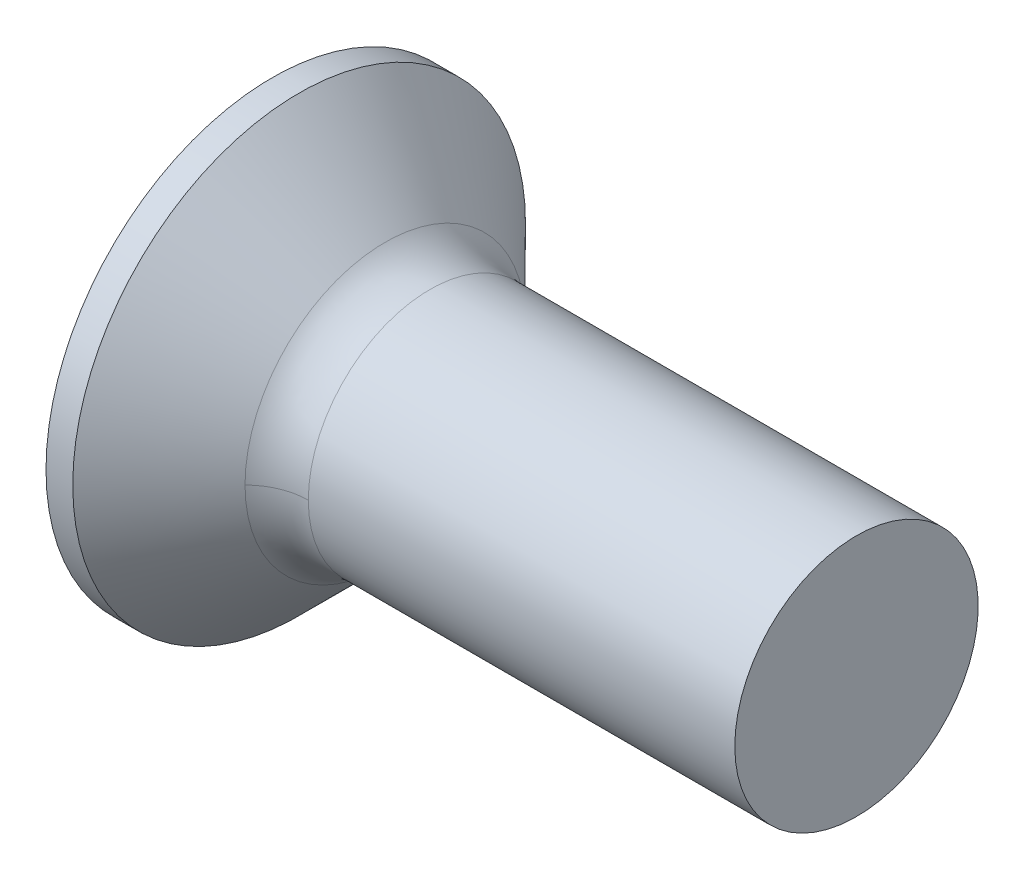
ISO-10303-21;
HEADER;
FILE_DESCRIPTION(('STEP AP214'),'2;1');
FILE_NAME('part.step','',(''),(''),'','','');
FILE_SCHEMA(('AUTOMOTIVE_DESIGN { 1 0 10303 214 1 1 1 1 }'));
ENDSEC;
DATA;
#1=APPLICATION_CONTEXT('core data for automotive mechanical design processes');
#2=APPLICATION_PROTOCOL_DEFINITION('international standard','automotive_design',2000,#1);
#3=PRODUCT_CONTEXT('',#1,'mechanical');
#4=PRODUCT('Part','Part','',(#3));
#5=PRODUCT_RELATED_PRODUCT_CATEGORY('part','',(#4));
#6=PRODUCT_DEFINITION_FORMATION('','',#4);
#7=PRODUCT_DEFINITION_CONTEXT('part definition',#1,'design');
#8=PRODUCT_DEFINITION('design','',#6,#7);
#9=PRODUCT_DEFINITION_SHAPE('','',#8);
#10=(LENGTH_UNIT() NAMED_UNIT(*) SI_UNIT(.MILLI.,.METRE.));
#11=(NAMED_UNIT(*) PLANE_ANGLE_UNIT() SI_UNIT($,.RADIAN.));
#12=(NAMED_UNIT(*) SI_UNIT($,.STERADIAN.) SOLID_ANGLE_UNIT());
#13=UNCERTAINTY_MEASURE_WITH_UNIT(LENGTH_MEASURE(1.E-05),#10,'distance_accuracy_value','');
#14=(GEOMETRIC_REPRESENTATION_CONTEXT(3) GLOBAL_UNCERTAINTY_ASSIGNED_CONTEXT((#13)) GLOBAL_UNIT_ASSIGNED_CONTEXT((#10,
#11,#12)) REPRESENTATION_CONTEXT('',''));
#15=CARTESIAN_POINT('',(0.,0.,0.));
#16=DIRECTION('',(0.,0.,1.));
#17=DIRECTION('',(1.,0.,0.));
#18=AXIS2_PLACEMENT_3D('',#15,#16,#17);
#19=CARTESIAN_POINT('',(3.05,0.,0.));
#20=DIRECTION('',(-1.,0.,0.));
#21=DIRECTION('',(0.,0.,1.));
#22=AXIS2_PLACEMENT_3D('',#19,#20,#21);
#23=CONICAL_SURFACE('',#22,0.851,0.0698131699402238);
#24=CARTESIAN_POINT('',(3.05,0.,0.));
#25=DIRECTION('',(-1.,0.,0.));
#26=DIRECTION('',(0.,0.,1.));
#27=AXIS2_PLACEMENT_3D('',#24,#25,#26);
#28=CIRCLE('',#27,0.851);
#29=CARTESIAN_POINT('',(3.05,0.515000000128447,-0.677477674811281));
#30=VERTEX_POINT('',#29);
#31=CARTESIAN_POINT('',(3.04999999998945,0.677477674911265,-0.514999999998138));
#32=VERTEX_POINT('',#31);
#33=EDGE_CURVE('E126',#30,#32,#28,.F.);
#34=ORIENTED_EDGE('',*,*,#33,.T.);
#35=CARTESIAN_POINT('',(-7.67570391463201E-11,0.931375357170448,-0.515));
#36=CARTESIAN_POINT('',(0.330572472848562,0.904946417906444,-0.515));
#37=CARTESIAN_POINT('',(0.661126771646041,0.878283148604802,-0.515));
#38=CARTESIAN_POINT('',(1.32217705983663,0.824265652939466,-0.515));
#39=CARTESIAN_POINT('',(1.65267304953057,0.796911430252112,-0.515));
#40=CARTESIAN_POINT('',(2.16096789406414,0.754133835706705,-0.515));
#41=CARTESIAN_POINT('',(2.33879401122227,0.739034945221815,-0.515));
#42=CARTESIAN_POINT('',(2.69441897396936,0.708513656055335,-0.515));
#43=CARTESIAN_POINT('',(2.87221781947904,0.693091256450383,-0.515));
#44=CARTESIAN_POINT('',(3.049999999979,0.677477674910982,-0.515));
#45=B_SPLINE_CURVE_WITH_KNOTS('',3,(#35,#36,#37,#38,#39,#40,#41,#42,#43,#44),.UNSPECIFIED.,.F.,
.F.,(4,2,2,2,4),(0.,0.994882626466528,1.98975996059805,2.52515761420332,3.06055679615058),.UNSPECIFIED.);
#46=CARTESIAN_POINT('',(0.,0.931375357164314,-0.515));
#47=VERTEX_POINT('',#46);
#48=EDGE_CURVE('E119',#47,#32,#45,.T.);
#49=ORIENTED_EDGE('',*,*,#48,.F.);
#50=CARTESIAN_POINT('',(0.,0.,0.));
#51=DIRECTION('',(-1.,0.,0.));
#52=DIRECTION('',(0.,0.,1.));
#53=AXIS2_PLACEMENT_3D('',#50,#51,#52);
#54=CIRCLE('',#53,1.064276776);
#55=CARTESIAN_POINT('',(-3.68055372291726E-11,0.515,-0.931375357167255));
#56=VERTEX_POINT('',#55);
#57=EDGE_CURVE('E20',#47,#56,#54,.T.);
#58=ORIENTED_EDGE('',*,*,#57,.T.);
#59=CARTESIAN_POINT('',(3.04999999998465,0.515,-0.677477674910271));
#60=CARTESIAN_POINT('',(2.78584457189711,0.515,-0.700667836997838));
#61=CARTESIAN_POINT('',(2.52165382800828,0.515,-0.723450546558568));
#62=CARTESIAN_POINT('',(1.9932175722748,0.515,-0.768360334127793));
#63=CARTESIAN_POINT('',(1.72897206064354,0.515,-0.79048741464414));
#64=CARTESIAN_POINT('',(1.2206193561181,0.515,-0.832574721749591));
#65=CARTESIAN_POINT('',(0.976515168975279,0.515,-0.852571390109687));
#66=CARTESIAN_POINT('',(0.488277611396775,0.515,-0.892216155988628));
#67=CARTESIAN_POINT('',(0.244144240861769,0.515,-0.911864252285126));
#68=CARTESIAN_POINT('',(-7.3606800830503E-11,0.515,-0.931375357170245));
#69=B_SPLINE_CURVE_WITH_KNOTS('',3,(#59,#60,#61,#62,#63,#64,#65,#66,#67,#68),.UNSPECIFIED.,.F.,
.F.,(4,2,2,2,4),(0.,0.795513252853999,1.59102346239218,2.3257888297006,3.06055677312136),.UNSPECIFIED.);
#70=EDGE_CURVE('E149',#30,#56,#69,.T.);
#71=ORIENTED_EDGE('',*,*,#70,.F.);
#72=EDGE_LOOP('',(#34,#49,#58,#71));
#73=FACE_BOUND('',#72,.T.);
#74=ADVANCED_FACE('F16',(#73),#23,.F.);
#75=CARTESIAN_POINT('',(0.,0.666842541,-0.515));
#76=DIRECTION('',(0.,0.,1.));
#77=DIRECTION('',(1.,0.,0.));
#78=AXIS2_PLACEMENT_3D('',#75,#76,#77);
#79=PLANE('',#78);
#80=DIRECTION('',(0.,1.,0.));
#81=VECTOR('',#80,1.);
#82=CARTESIAN_POINT('',(3.05,1.5637388375,-0.515));
#83=LINE('',#82,#81);
#84=CARTESIAN_POINT('',(3.05,0.929326148090736,-0.515));
#85=VERTEX_POINT('',#84);
#86=EDGE_CURVE('E140',#32,#85,#83,.T.);
#87=ORIENTED_EDGE('',*,*,#86,.T.);
#88=DIRECTION('',(0.894934367760736,-0.446197800757345,0.));
#89=VECTOR('',#88,1.);
#90=CARTESIAN_POINT('',(1.525,1.689663074,-0.515));
#91=LINE('',#90,#89);
#92=CARTESIAN_POINT('',(0.,2.44999999986994,-0.515));
#93=VERTEX_POINT('',#92);
#94=EDGE_CURVE('E123',#93,#85,#91,.T.);
#95=ORIENTED_EDGE('',*,*,#94,.F.);
#96=DIRECTION('',(0.,-1.,0.));
#97=VECTOR('',#96,1.);
#98=CARTESIAN_POINT('',(0.,1.5637388375,-0.515));
#99=LINE('',#98,#97);
#100=EDGE_CURVE('E114',#93,#47,#99,.T.);
#101=ORIENTED_EDGE('',*,*,#100,.T.);
#102=ORIENTED_EDGE('',*,*,#48,.T.);
#103=EDGE_LOOP('',(#87,#95,#101,#102));
#104=FACE_BOUND('',#103,.T.);
#105=ADVANCED_FACE('F117',(#104),#79,.T.);
#106=CARTESIAN_POINT('',(12.,-2.53,2.53));
#107=DIRECTION('',(1.,0.,0.));
#108=DIRECTION('',(0.,0.,-1.));
#109=AXIS2_PLACEMENT_3D('',#106,#107,#108);
#110=PLANE('',#109);
#111=CARTESIAN_POINT('',(12.,0.,0.));
#112=DIRECTION('',(-1.,0.,0.));
#113=DIRECTION('',(0.,0.,1.));
#114=AXIS2_PLACEMENT_3D('',#111,#112,#113);
#115=CIRCLE('',#114,2.5);
#116=CARTESIAN_POINT('',(12.,0.,2.5));
#117=VERTEX_POINT('',#116);
#118=EDGE_CURVE('E381',#117,#117,#115,.F.);
#119=ORIENTED_EDGE('',*,*,#118,.T.);
#120=EDGE_LOOP('',(#119));
#121=FACE_BOUND('',#120,.T.);
#122=ADVANCED_FACE('F520',(#121),#110,.T.);
#123=CARTESIAN_POINT('',(0.,0.515,-2.460635134));
#124=DIRECTION('',(0.,-1.,0.));
#125=DIRECTION('',(1.,0.,0.));
#126=AXIS2_PLACEMENT_3D('',#123,#124,#125);
#127=PLANE('',#126);
#128=DIRECTION('',(0.,0.,-1.));
#129=VECTOR('',#128,1.);
#130=CARTESIAN_POINT('',(0.,0.515,-1.5637388375));
#131=LINE('',#130,#129);
#132=CARTESIAN_POINT('',(0.,0.515,-2.44999999986994));
#133=VERTEX_POINT('',#132);
#134=EDGE_CURVE('E135',#56,#133,#131,.T.);
#135=ORIENTED_EDGE('',*,*,#134,.T.);
#136=DIRECTION('',(-0.894934367760736,0.,-0.446197800757345));
#137=VECTOR('',#136,1.);
#138=CARTESIAN_POINT('',(1.525,0.515,-1.689663074));
#139=LINE('',#138,#137);
#140=CARTESIAN_POINT('',(3.05,0.515,-0.929326148090736));
#141=VERTEX_POINT('',#140);
#142=EDGE_CURVE('E363',#141,#133,#139,.T.);
#143=ORIENTED_EDGE('',*,*,#142,.F.);
#144=DIRECTION('',(0.,0.,1.));
#145=VECTOR('',#144,1.);
#146=CARTESIAN_POINT('',(3.05,0.515,-1.5637388375));
#147=LINE('',#146,#145);
#148=EDGE_CURVE('E141',#141,#30,#147,.T.);
#149=ORIENTED_EDGE('',*,*,#148,.T.);
#150=ORIENTED_EDGE('',*,*,#70,.T.);
#151=EDGE_LOOP('',(#135,#143,#149,#150));
#152=FACE_BOUND('',#151,.T.);
#153=ADVANCED_FACE('F553',(#152),#127,.T.);
#154=CARTESIAN_POINT('',(0.,2.45,-0.515));
#155=DIRECTION('',(-0.446197800757345,-0.894934367760736,0.));
#156=DIRECTION('',(0.894934367760736,-0.446197800757345,0.));
#157=AXIS2_PLACEMENT_3D('',#154,#155,#156);
#158=PLANE('',#157);
#159=ORIENTED_EDGE('',*,*,#94,.T.);
#160=DIRECTION('',(0.,0.,1.));
#161=VECTOR('',#160,1.);
#162=CARTESIAN_POINT('',(3.05,0.929326148,0.));
#163=LINE('',#162,#161);
#164=CARTESIAN_POINT('',(3.05,0.929326148136104,0.515));
#165=VERTEX_POINT('',#164);
#166=EDGE_CURVE('E379',#85,#165,#163,.T.);
#167=ORIENTED_EDGE('',*,*,#166,.T.);
#168=DIRECTION('',(0.894934367838347,-0.446197800601682,0.));
#169=VECTOR('',#168,1.);
#170=CARTESIAN_POINT('',(0.,2.44999999960982,0.515));
#171=LINE('',#170,#169);
#172=CARTESIAN_POINT('',(0.,2.44999999980491,0.515));
#173=VERTEX_POINT('',#172);
#174=EDGE_CURVE('E353',#173,#165,#171,.T.);
#175=ORIENTED_EDGE('',*,*,#174,.F.);
#176=DIRECTION('',(0.,0.,-1.));
#177=VECTOR('',#176,1.);
#178=CARTESIAN_POINT('',(0.,2.45,0.));
#179=LINE('',#178,#177);
#180=EDGE_CURVE('E374',#173,#93,#179,.T.);
#181=ORIENTED_EDGE('',*,*,#180,.T.);
#182=EDGE_LOOP('',(#159,#167,#175,#181));
#183=FACE_BOUND('',#182,.T.);
#184=ADVANCED_FACE('F165',(#183),#158,.T.);
#185=CARTESIAN_POINT('',(12.,0.,0.));
#186=DIRECTION('',(-1.,0.,0.));
#187=DIRECTION('',(0.,0.,1.));
#188=AXIS2_PLACEMENT_3D('',#185,#186,#187);
#189=CYLINDRICAL_SURFACE('',#188,2.5);
#190=ORIENTED_EDGE('',*,*,#118,.F.);
#191=EDGE_LOOP('',(#190));
#192=FACE_BOUND('',#191,.T.);
#193=CARTESIAN_POINT('',(3.23847763096331,0.,0.));
#194=DIRECTION('',(1.,0.,0.));
#195=DIRECTION('',(0.,1.,0.));
#196=AXIS2_PLACEMENT_3D('',#193,#194,#195);
#197=CIRCLE('',#196,2.49999999985679);
#198=CARTESIAN_POINT('',(3.23847763096991,-2.56379285644164E-10,-2.49999999989259));
#199=VERTEX_POINT('',#198);
#200=CARTESIAN_POINT('',(3.23847763095945,-1.12242035535916E-10,2.49999999989259));
#201=VERTEX_POINT('',#200);
#202=EDGE_CURVE('E343',#199,#201,#197,.T.);
#203=ORIENTED_EDGE('',*,*,#202,.T.);
#204=CARTESIAN_POINT('',(3.23847763096331,0.,0.));
#205=DIRECTION('',(1.,0.,0.));
#206=DIRECTION('',(0.,1.,0.));
#207=AXIS2_PLACEMENT_3D('',#204,#205,#206);
#208=CIRCLE('',#207,2.49999999985679);
#209=EDGE_CURVE('E332',#201,#199,#208,.T.);
#210=ORIENTED_EDGE('',*,*,#209,.T.);
#211=EDGE_LOOP('',(#203,#210));
#212=FACE_BOUND('',#211,.T.);
#213=ADVANCED_FACE('F160',(#192,#212),#189,.T.);
#214=CARTESIAN_POINT('',(3.05,0.515,-0.929326148));
#215=DIRECTION('',(-0.446197800757345,0.,0.894934367760736));
#216=DIRECTION('',(-0.894934367760736,0.,-0.446197800757345));
#217=AXIS2_PLACEMENT_3D('',#214,#215,#216);
#218=PLANE('',#217);
#219=DIRECTION('',(-0.894934367838347,0.,-0.446197800601682));
#220=VECTOR('',#219,1.);
#221=CARTESIAN_POINT('',(3.05,-0.515,-0.929326148272208));
#222=LINE('',#221,#220);
#223=CARTESIAN_POINT('',(3.05,-0.515,-0.929326148136104));
#224=VERTEX_POINT('',#223);
#225=CARTESIAN_POINT('',(0.,-0.515,-2.44999999980491));
#226=VERTEX_POINT('',#225);
#227=EDGE_CURVE('E318',#224,#226,#222,.T.);
#228=ORIENTED_EDGE('',*,*,#227,.F.);
#229=DIRECTION('',(0.,1.,0.));
#230=VECTOR('',#229,1.);
#231=CARTESIAN_POINT('',(3.05,0.,-0.929326148));
#232=LINE('',#231,#230);
#233=EDGE_CURVE('E356',#224,#141,#232,.T.);
#234=ORIENTED_EDGE('',*,*,#233,.T.);
#235=ORIENTED_EDGE('',*,*,#142,.T.);
#236=DIRECTION('',(0.,-1.,0.));
#237=VECTOR('',#236,1.);
#238=CARTESIAN_POINT('',(0.,0.,-2.45));
#239=LINE('',#238,#237);
#240=EDGE_CURVE('E359',#133,#226,#239,.T.);
#241=ORIENTED_EDGE('',*,*,#240,.T.);
#242=EDGE_LOOP('',(#228,#234,#235,#241));
#243=FACE_BOUND('',#242,.T.);
#244=ADVANCED_FACE('F164',(#243),#218,.T.);
#245=CARTESIAN_POINT('',(0.,0.666842541,0.515));
#246=DIRECTION('',(0.,0.,-1.));
#247=DIRECTION('',(0.,1.,0.));
#248=AXIS2_PLACEMENT_3D('',#245,#246,#247);
#249=PLANE('',#248);
#250=DIRECTION('',(0.,1.,0.));
#251=VECTOR('',#250,1.);
#252=CARTESIAN_POINT('',(0.,1.5637388375,0.515));
#253=LINE('',#252,#251);
#254=CARTESIAN_POINT('',(0.,0.931375357164314,0.515));
#255=VERTEX_POINT('',#254);
#256=EDGE_CURVE('E348',#255,#173,#253,.T.);
#257=ORIENTED_EDGE('',*,*,#256,.T.);
#258=ORIENTED_EDGE('',*,*,#174,.T.);
#259=DIRECTION('',(0.,-1.,0.));
#260=VECTOR('',#259,1.);
#261=CARTESIAN_POINT('',(3.05,1.5637388375,0.515));
#262=LINE('',#261,#260);
#263=CARTESIAN_POINT('',(3.05,0.677477675015967,0.514999999859184));
#264=VERTEX_POINT('',#263);
#265=EDGE_CURVE('E354',#165,#264,#262,.T.);
#266=ORIENTED_EDGE('',*,*,#265,.T.);
#267=CARTESIAN_POINT('',(-8.40686860052449E-11,0.931375357171032,0.515));
#268=CARTESIAN_POINT('',(0.330572472841409,0.90494641790702,0.515));
#269=CARTESIAN_POINT('',(0.661126771639048,0.878283148605369,0.515));
#270=CARTESIAN_POINT('',(1.32217705982996,0.824265652940016,0.515));
#271=CARTESIAN_POINT('',(1.65267304952405,0.796911430252655,0.515));
#272=CARTESIAN_POINT('',(2.16096789405845,0.754133835707187,0.515));
#273=CARTESIAN_POINT('',(2.33879401121725,0.739034945222243,0.515));
#274=CARTESIAN_POINT('',(2.69441897396568,0.708513656055654,0.515));
#275=CARTESIAN_POINT('',(2.87221781947602,0.693091256450646,0.515));
#276=CARTESIAN_POINT('',(3.04999999997665,0.677477674911189,0.515));
#277=B_SPLINE_CURVE_WITH_KNOTS('',3,(#267,#268,#269,#270,#271,#272,#273,#274,#275,#276),
.UNSPECIFIED.,.F.,.F.,(4,2,2,2,4),(0.,0.994882626467006,1.98975996059901,2.52515761420628,
3.06055679615556),.UNSPECIFIED.);
#278=EDGE_CURVE('E200',#255,#264,#277,.T.);
#279=ORIENTED_EDGE('',*,*,#278,.F.);
#280=EDGE_LOOP('',(#257,#258,#266,#279));
#281=FACE_BOUND('',#280,.T.);
#282=ADVANCED_FACE('F173',(#281),#249,.T.);
#283=CARTESIAN_POINT('',(3.368261073,0.,2.506494585));
#284=CARTESIAN_POINT('',(3.368261073,5.01298917,2.506494585));
#285=CARTESIAN_POINT('',(3.368261073,5.01298917,-2.506494585));
#286=CARTESIAN_POINT('',(3.368261073,0.,-2.506494585));
#287=CARTESIAN_POINT('',(2.925242194,0.,2.462044431));
#288=CARTESIAN_POINT('',(2.925242194,4.924088862,2.462044431));
#289=CARTESIAN_POINT('',(2.925242194,4.924088862,-2.462044431));
#290=CARTESIAN_POINT('',(2.925242194,0.,-2.462044431));
#291=CARTESIAN_POINT('',(2.513891077,0.,2.632431643));
#292=CARTESIAN_POINT('',(2.513891077,5.264863285,2.632431643));
#293=CARTESIAN_POINT('',(2.513891077,5.264863285,-2.632431643));
#294=CARTESIAN_POINT('',(2.513891077,0.,-2.632431643));
#295=CARTESIAN_POINT('',(2.232060429,0.,2.977124301));
#296=CARTESIAN_POINT('',(2.232060429,5.954248603,2.977124301));
#297=CARTESIAN_POINT('',(2.232060429,5.954248603,-2.977124301));
#298=CARTESIAN_POINT('',(2.232060429,0.,-2.977124301));
#299=(BOUNDED_SURFACE() B_SPLINE_SURFACE(3,3,((#283,#284,#285,#286),(#287,#288,#289,#290),(#291,
#292,#293,#294),(#295,#296,#297,#298)),.UNSPECIFIED.,.F.,.F.,
.F.) B_SPLINE_SURFACE_WITH_KNOTS((4,4),(4,4),(0.,1.),(0.,1.),
.UNSPECIFIED.) GEOMETRIC_REPRESENTATION_ITEM() RATIONAL_B_SPLINE_SURFACE(((1.,0.333333333333333,
0.333333333333333,1.),(0.920706259011135,0.306902086337045,0.306902086337045,0.920706259011135),
(0.920706259011135,0.306902086337045,0.306902086337045,0.920706259011135),(1.,0.333333333333333,
0.333333333333333,1.))) REPRESENTATION_ITEM('') SURFACE());
#300=CARTESIAN_POINT('',(2.31923881600005,0.,0.));
#301=DIRECTION('',(-1.,0.,0.));
#302=DIRECTION('',(0.,0.,1.));
#303=AXIS2_PLACEMENT_3D('',#300,#301,#302);
#304=CIRCLE('',#303,2.880761184);
#305=CARTESIAN_POINT('',(2.319238815924,-8.86280993358422E-10,-2.88076118401307));
#306=VERTEX_POINT('',#305);
#307=CARTESIAN_POINT('',(2.31923881597038,-2.58673999348011E-10,2.88076118396668));
#308=VERTEX_POINT('',#307);
#309=EDGE_CURVE('E304',#306,#308,#304,.F.);
#310=CARTESIAN_POINT('',(3.368261073,0.,2.506494585));
#311=CARTESIAN_POINT('',(2.925242194,0.,2.462044431));
#312=CARTESIAN_POINT('',(2.513891077,0.,2.632431643));
#313=CARTESIAN_POINT('',(2.232060429,0.,2.977124301));
#314=(BOUNDED_CURVE() B_SPLINE_CURVE(3,(#310,#311,#312,#313),.UNSPECIFIED.,.F.,
.F.) B_SPLINE_CURVE_WITH_KNOTS((4,4),(0.,1.),
.UNSPECIFIED.) CURVE() GEOMETRIC_REPRESENTATION_ITEM() RATIONAL_B_SPLINE_CURVE((1.,
0.920706259011135,0.920706259011135,1.)) REPRESENTATION_ITEM(''));
#315=EDGE_CURVE('E337',#308,#201,#314,.F.);
#316=CARTESIAN_POINT('',(3.368261073,0.,-2.506494585));
#317=CARTESIAN_POINT('',(2.925242194,0.,-2.462044431));
#318=CARTESIAN_POINT('',(2.513891077,0.,-2.632431643));
#319=CARTESIAN_POINT('',(2.232060429,0.,-2.977124301));
#320=(BOUNDED_CURVE() B_SPLINE_CURVE(3,(#316,#317,#318,#319),.UNSPECIFIED.,.F.,
.F.) B_SPLINE_CURVE_WITH_KNOTS((4,4),(0.,1.),
.UNSPECIFIED.) CURVE() GEOMETRIC_REPRESENTATION_ITEM() RATIONAL_B_SPLINE_CURVE((1.,
0.920706259011135,0.920706259011135,1.)) REPRESENTATION_ITEM(''));
#321=EDGE_CURVE('E323',#199,#306,#320,.T.);
#322=ORIENTED_EDGE('',*,*,#309,.T.);
#323=ORIENTED_EDGE('',*,*,#315,.T.);
#324=ORIENTED_EDGE('',*,*,#202,.F.);
#325=ORIENTED_EDGE('',*,*,#321,.T.);
#326=EDGE_LOOP('',(#322,#323,#324,#325));
#327=FACE_BOUND('',#326,.T.);
#328=ADVANCED_FACE('F167',(#327),#299,.F.);
#329=CARTESIAN_POINT('',(3.368261073,0.,-2.506494585));
#330=CARTESIAN_POINT('',(3.368261073,-5.01298917,-2.506494585));
#331=CARTESIAN_POINT('',(3.368261073,-5.01298917,2.506494585));
#332=CARTESIAN_POINT('',(3.368261073,0.,2.506494585));
#333=CARTESIAN_POINT('',(2.925242194,0.,-2.462044431));
#334=CARTESIAN_POINT('',(2.925242194,-4.924088862,-2.462044431));
#335=CARTESIAN_POINT('',(2.925242194,-4.924088862,2.462044431));
#336=CARTESIAN_POINT('',(2.925242194,0.,2.462044431));
#337=CARTESIAN_POINT('',(2.513891077,0.,-2.632431643));
#338=CARTESIAN_POINT('',(2.513891077,-5.264863285,-2.632431643));
#339=CARTESIAN_POINT('',(2.513891077,-5.264863285,2.632431643));
#340=CARTESIAN_POINT('',(2.513891077,0.,2.632431643));
#341=CARTESIAN_POINT('',(2.232060429,0.,-2.977124301));
#342=CARTESIAN_POINT('',(2.232060429,-5.954248603,-2.977124301));
#343=CARTESIAN_POINT('',(2.232060429,-5.954248603,2.977124301));
#344=CARTESIAN_POINT('',(2.232060429,0.,2.977124301));
#345=(BOUNDED_SURFACE() B_SPLINE_SURFACE(3,3,((#329,#330,#331,#332),(#333,#334,#335,#336),(#337,
#338,#339,#340),(#341,#342,#343,#344)),.UNSPECIFIED.,.F.,.F.,
.F.) B_SPLINE_SURFACE_WITH_KNOTS((4,4),(4,4),(0.,1.),(0.,1.),
.UNSPECIFIED.) GEOMETRIC_REPRESENTATION_ITEM() RATIONAL_B_SPLINE_SURFACE(((1.,0.333333333333333,
0.333333333333333,1.),(0.920706259011135,0.306902086337045,0.306902086337045,0.920706259011135),
(0.920706259011135,0.306902086337045,0.306902086337045,0.920706259011135),(1.,0.333333333333333,
0.333333333333333,1.))) REPRESENTATION_ITEM('') SURFACE());
#346=CARTESIAN_POINT('',(2.31923881600005,0.,0.));
#347=DIRECTION('',(-1.,0.,0.));
#348=DIRECTION('',(0.,0.,1.));
#349=AXIS2_PLACEMENT_3D('',#346,#347,#348);
#350=CIRCLE('',#349,2.880761184);
#351=EDGE_CURVE('E298',#308,#306,#350,.F.);
#352=ORIENTED_EDGE('',*,*,#321,.F.);
#353=ORIENTED_EDGE('',*,*,#209,.F.);
#354=ORIENTED_EDGE('',*,*,#315,.F.);
#355=ORIENTED_EDGE('',*,*,#351,.T.);
#356=EDGE_LOOP('',(#352,#353,#354,#355));
#357=FACE_BOUND('',#356,.T.);
#358=ADVANCED_FACE('F172',(#357),#345,.F.);
#359=CARTESIAN_POINT('',(0.,-0.515,-2.460635134));
#360=DIRECTION('',(0.,1.,0.));
#361=DIRECTION('',(0.,0.,1.));
#362=AXIS2_PLACEMENT_3D('',#359,#360,#361);
#363=PLANE('',#362);
#364=DIRECTION('',(0.,0.,-1.));
#365=VECTOR('',#364,1.);
#366=CARTESIAN_POINT('',(3.05,-0.515,-1.5637388375));
#367=LINE('',#366,#365);
#368=CARTESIAN_POINT('',(3.05,-0.515000000067614,-0.67747767485753));
#369=VERTEX_POINT('',#368);
#370=EDGE_CURVE('E319',#369,#224,#367,.T.);
#371=ORIENTED_EDGE('',*,*,#370,.T.);
#372=ORIENTED_EDGE('',*,*,#227,.T.);
#373=DIRECTION('',(0.,0.,1.));
#374=VECTOR('',#373,1.);
#375=CARTESIAN_POINT('',(0.,-0.515,-1.5637388375));
#376=LINE('',#375,#374);
#377=CARTESIAN_POINT('',(-3.70023635906891E-11,-0.515,-0.93137535716727));
#378=VERTEX_POINT('',#377);
#379=EDGE_CURVE('E321',#226,#378,#376,.T.);
#380=ORIENTED_EDGE('',*,*,#379,.T.);
#381=CARTESIAN_POINT('',(3.04999999999045,-0.515,-0.677477674909761));
#382=CARTESIAN_POINT('',(2.78584457190303,-0.515,-0.700667836997324));
#383=CARTESIAN_POINT('',(2.52165382801433,-0.515,-0.723450546558049));
#384=CARTESIAN_POINT('',(1.99321757228111,-0.515,-0.768360334127263));
#385=CARTESIAN_POINT('',(1.72897206064996,-0.515,-0.790487414643603));
#386=CARTESIAN_POINT('',(1.22061935612349,-0.515,-0.832574721749148));
#387=CARTESIAN_POINT('',(0.976515168979518,-0.515,-0.852571390109341));
#388=CARTESIAN_POINT('',(0.488277611398697,-0.515,-0.892216155988473));
#389=CARTESIAN_POINT('',(0.244144240862533,-0.515,-0.911864252285065));
#390=CARTESIAN_POINT('',(-7.40009102619692E-11,-0.515,-0.931375357170277));
#391=B_SPLINE_CURVE_WITH_KNOTS('',3,(#381,#382,#383,#384,#385,#386,#387,#388,#389,#390),
.UNSPECIFIED.,.F.,.F.,(4,2,2,2,4),(0.,0.79551325285362,1.59102346239142,2.32578882970333,
3.06055677312757),.UNSPECIFIED.);
#392=EDGE_CURVE('E290',#369,#378,#391,.T.);
#393=ORIENTED_EDGE('',*,*,#392,.F.);
#394=EDGE_LOOP('',(#371,#372,#380,#393));
#395=FACE_BOUND('',#394,.T.);
#396=ADVANCED_FACE('F184',(#395),#363,.T.);
#397=CARTESIAN_POINT('',(3.05,0.,0.));
#398=DIRECTION('',(-1.,0.,0.));
#399=DIRECTION('',(0.,0.,1.));
#400=AXIS2_PLACEMENT_3D('',#397,#398,#399);
#401=CONICAL_SURFACE('',#400,0.851,0.0698131699402238);
#402=CARTESIAN_POINT('',(0.,0.,0.));
#403=DIRECTION('',(-1.,0.,0.));
#404=DIRECTION('',(0.,0.,1.));
#405=AXIS2_PLACEMENT_3D('',#402,#403,#404);
#406=CIRCLE('',#405,1.064276776);
#407=CARTESIAN_POINT('',(0.,0.515,0.931375357164314));
#408=VERTEX_POINT('',#407);
#409=EDGE_CURVE('E317',#408,#255,#406,.T.);
#410=ORIENTED_EDGE('',*,*,#409,.T.);
#411=ORIENTED_EDGE('',*,*,#278,.T.);
#412=CARTESIAN_POINT('',(3.05,0.,0.));
#413=DIRECTION('',(-1.,0.,0.));
#414=DIRECTION('',(0.,0.,1.));
#415=AXIS2_PLACEMENT_3D('',#412,#413,#414);
#416=CIRCLE('',#415,0.851);
#417=CARTESIAN_POINT('',(3.04999999998791,0.514999999928661,0.677477674964214));
#418=VERTEX_POINT('',#417);
#419=EDGE_CURVE('E314',#264,#418,#416,.F.);
#420=ORIENTED_EDGE('',*,*,#419,.T.);
#421=CARTESIAN_POINT('',(-7.84343790706511E-11,0.515,0.931375357170582));
#422=CARTESIAN_POINT('',(0.330572472846921,0.515,0.904946417906576));
#423=CARTESIAN_POINT('',(0.661126771644437,0.515,0.878283148604932));
#424=CARTESIAN_POINT('',(1.3221770598351,0.515,0.824265652939592));
#425=CARTESIAN_POINT('',(1.65267304952907,0.515,0.796911430252237));
#426=CARTESIAN_POINT('',(2.1609678940624,0.515,0.754133835706851));
#427=CARTESIAN_POINT('',(2.33879401122026,0.515,0.739034945221986));
#428=CARTESIAN_POINT('',(2.6944189739668,0.515,0.708513656055556));
#429=CARTESIAN_POINT('',(2.8722178194762,0.515,0.69309125645063));
#430=CARTESIAN_POINT('',(3.04999999997588,0.515,0.677477674911256));
#431=B_SPLINE_CURVE_WITH_KNOTS('',3,(#421,#422,#423,#424,#425,#426,#427,#428,#429,#430),
.UNSPECIFIED.,.F.,.F.,(4,2,2,2,4),(0.,0.994882626466638,1.98975996059827,2.52515761420271,
3.06055679614914),.UNSPECIFIED.);
#432=EDGE_CURVE('E208',#408,#418,#431,.T.);
#433=ORIENTED_EDGE('',*,*,#432,.F.);
#434=EDGE_LOOP('',(#410,#411,#420,#433));
#435=FACE_BOUND('',#434,.T.);
#436=ADVANCED_FACE('F186',(#435),#401,.F.);
#437=CARTESIAN_POINT('',(2.319238816,0.,0.));
#438=DIRECTION('',(-1.,0.,0.));
#439=DIRECTION('',(0.,0.,1.));
#440=AXIS2_PLACEMENT_3D('',#437,#438,#439);
#441=CONICAL_SURFACE('',#440,2.880761184,0.785398163397448);
#442=ORIENTED_EDGE('',*,*,#351,.F.);
#443=ORIENTED_EDGE('',*,*,#309,.F.);
#444=EDGE_LOOP('',(#442,#443));
#445=FACE_BOUND('',#444,.T.);
#446=CARTESIAN_POINT('',(0.55,0.,0.));
#447=DIRECTION('',(-1.,0.,0.));
#448=DIRECTION('',(0.,0.,1.));
#449=AXIS2_PLACEMENT_3D('',#446,#447,#448);
#450=CIRCLE('',#449,4.65);
#451=CARTESIAN_POINT('',(0.55,0.,4.65));
#452=VERTEX_POINT('',#451);
#453=EDGE_CURVE('E310',#452,#452,#450,.F.);
#454=ORIENTED_EDGE('',*,*,#453,.T.);
#455=EDGE_LOOP('',(#454));
#456=FACE_BOUND('',#455,.T.);
#457=ADVANCED_FACE('F195',(#445,#456),#441,.T.);
#458=CARTESIAN_POINT('',(3.05,0.,0.));
#459=DIRECTION('',(-1.,0.,0.));
#460=DIRECTION('',(0.,0.,1.));
#461=AXIS2_PLACEMENT_3D('',#458,#459,#460);
#462=CONICAL_SURFACE('',#461,0.851,0.0698131699402238);
#463=CARTESIAN_POINT('',(0.,0.,0.));
#464=DIRECTION('',(-1.,0.,0.));
#465=DIRECTION('',(0.,0.,1.));
#466=AXIS2_PLACEMENT_3D('',#463,#464,#465);
#467=CIRCLE('',#466,1.064276776);
#468=CARTESIAN_POINT('',(-7.43551893628162E-11,-0.93137535611612,-0.5150000019064));
#469=VERTEX_POINT('',#468);
#470=EDGE_CURVE('E224',#378,#469,#467,.T.);
#471=ORIENTED_EDGE('',*,*,#470,.T.);
#472=CARTESIAN_POINT('',(3.04999999998159,-0.67747767491054,-0.515));
#473=CARTESIAN_POINT('',(2.78584457189397,-0.70066783699811,-0.515));
#474=CARTESIAN_POINT('',(2.52165382800508,-0.723450546558843,-0.515));
#475=CARTESIAN_POINT('',(1.99321757227147,-0.768360334128074,-0.515));
#476=CARTESIAN_POINT('',(1.72897206064013,-0.790487414644424,-0.515));
#477=CARTESIAN_POINT('',(1.22061935610269,-0.832574721750865,-0.515));
#478=CARTESIAN_POINT('',(0.976515168947937,-0.852571390111926,-0.515));
#479=CARTESIAN_POINT('',(0.488277611345555,-0.892216155992768,-0.515));
#480=CARTESIAN_POINT('',(0.244144240798611,-0.911864252290202,-0.515));
#481=CARTESIAN_POINT('',(-1.4870572436423E-10,-0.931375357176246,-0.515));
#482=B_SPLINE_CURVE_WITH_KNOTS('',3,(#472,#473,#474,#475,#476,#477,#478,#479,#480,#481),
.UNSPECIFIED.,.F.,.F.,(4,2,2,2,4),(0.,0.795513252854199,1.59102346239258,2.32578882973693,
3.06055677319361),.UNSPECIFIED.);
#483=CARTESIAN_POINT('',(3.05,-0.677477674864095,-0.51500000005897));
#484=VERTEX_POINT('',#483);
#485=EDGE_CURVE('E218',#484,#469,#482,.T.);
#486=ORIENTED_EDGE('',*,*,#485,.F.);
#487=CARTESIAN_POINT('',(3.05,0.,0.));
#488=DIRECTION('',(-1.,0.,0.));
#489=DIRECTION('',(0.,0.,1.));
#490=AXIS2_PLACEMENT_3D('',#487,#488,#489);
#491=CIRCLE('',#490,0.851);
#492=EDGE_CURVE('E295',#484,#369,#491,.F.);
#493=ORIENTED_EDGE('',*,*,#492,.T.);
#494=ORIENTED_EDGE('',*,*,#392,.T.);
#495=EDGE_LOOP('',(#471,#486,#493,#494));
#496=FACE_BOUND('',#495,.T.);
#497=ADVANCED_FACE('F230',(#496),#462,.F.);
#498=CARTESIAN_POINT('',(0.,0.515,0.666842541));
#499=DIRECTION('',(0.,-1.,0.));
#500=DIRECTION('',(1.,0.,0.));
#501=AXIS2_PLACEMENT_3D('',#498,#499,#500);
#502=PLANE('',#501);
#503=DIRECTION('',(0.,0.,1.));
#504=VECTOR('',#503,1.);
#505=CARTESIAN_POINT('',(3.05,0.515,1.5637388375));
#506=LINE('',#505,#504);
#507=CARTESIAN_POINT('',(3.05,0.515,0.929326148090736));
#508=VERTEX_POINT('',#507);
#509=EDGE_CURVE('E216',#418,#508,#506,.T.);
#510=ORIENTED_EDGE('',*,*,#509,.T.);
#511=DIRECTION('',(0.894934367760736,0.,-0.446197800757345));
#512=VECTOR('',#511,1.);
#513=CARTESIAN_POINT('',(1.525,0.515,1.689663074));
#514=LINE('',#513,#512);
#515=CARTESIAN_POINT('',(-5.65647283063779E-10,0.515000001270933,2.4500000015685));
#516=VERTEX_POINT('',#515);
#517=EDGE_CURVE('E455',#516,#508,#514,.T.);
#518=ORIENTED_EDGE('',*,*,#517,.F.);
#519=DIRECTION('',(0.,0.,-1.));
#520=VECTOR('',#519,1.);
#521=CARTESIAN_POINT('',(0.,0.515,1.5637388375));
#522=LINE('',#521,#520);
#523=EDGE_CURVE('E217',#516,#408,#522,.T.);
#524=ORIENTED_EDGE('',*,*,#523,.T.);
#525=ORIENTED_EDGE('',*,*,#432,.T.);
#526=EDGE_LOOP('',(#510,#518,#524,#525));
#527=FACE_BOUND('',#526,.T.);
#528=ADVANCED_FACE('F225',(#527),#502,.T.);
#529=CARTESIAN_POINT('',(0.55,0.,0.));
#530=DIRECTION('',(-1.,0.,0.));
#531=DIRECTION('',(0.,0.,1.));
#532=AXIS2_PLACEMENT_3D('',#529,#530,#531);
#533=CYLINDRICAL_SURFACE('',#532,4.65);
#534=ORIENTED_EDGE('',*,*,#453,.F.);
#535=EDGE_LOOP('',(#534));
#536=FACE_BOUND('',#535,.T.);
#537=CARTESIAN_POINT('',(0.,0.,0.));
#538=DIRECTION('',(-1.,0.,0.));
#539=DIRECTION('',(0.,0.,1.));
#540=AXIS2_PLACEMENT_3D('',#537,#538,#539);
#541=CIRCLE('',#540,4.65);
#542=CARTESIAN_POINT('',(0.,0.,4.65));
#543=VERTEX_POINT('',#542);
#544=EDGE_CURVE('E454',#543,#543,#541,.T.);
#545=ORIENTED_EDGE('',*,*,#544,.F.);
#546=EDGE_LOOP('',(#545));
#547=FACE_BOUND('',#546,.T.);
#548=ADVANCED_FACE('F229',(#536,#547),#533,.T.);
#549=CARTESIAN_POINT('',(0.,-2.460635134,-0.515));
#550=DIRECTION('',(0.,0.,1.));
#551=DIRECTION('',(1.,0.,0.));
#552=AXIS2_PLACEMENT_3D('',#549,#550,#551);
#553=PLANE('',#552);
#554=DIRECTION('',(0.,1.,0.));
#555=VECTOR('',#554,1.);
#556=CARTESIAN_POINT('',(0.,0.,-0.5150000038128));
#557=LINE('',#556,#555);
#558=CARTESIAN_POINT('',(0.,-2.45000000141653,-0.515000001270933));
#559=VERTEX_POINT('',#558);
#560=EDGE_CURVE('E443',#559,#469,#557,.T.);
#561=ORIENTED_EDGE('',*,*,#560,.F.);
#562=DIRECTION('',(-0.894934367760736,-0.446197800757345,0.));
#563=VECTOR('',#562,1.);
#564=CARTESIAN_POINT('',(1.525,-1.689663074,-0.515));
#565=LINE('',#564,#563);
#566=CARTESIAN_POINT('',(3.05,-0.929326148090736,-0.515));
#567=VERTEX_POINT('',#566);
#568=EDGE_CURVE('E440',#567,#559,#565,.T.);
#569=ORIENTED_EDGE('',*,*,#568,.F.);
#570=DIRECTION('',(0.,1.,0.));
#571=VECTOR('',#570,1.);
#572=CARTESIAN_POINT('',(3.05,-1.5637388375,-0.515));
#573=LINE('',#572,#571);
#574=EDGE_CURVE('E313',#567,#484,#573,.T.);
#575=ORIENTED_EDGE('',*,*,#574,.T.);
#576=ORIENTED_EDGE('',*,*,#485,.T.);
#577=EDGE_LOOP('',(#561,#569,#575,#576));
#578=FACE_BOUND('',#577,.T.);
#579=ADVANCED_FACE('F233',(#578),#553,.T.);
#580=CARTESIAN_POINT('',(0.,0.515,2.45));
#581=DIRECTION('',(-0.446197800757345,0.,-0.894934367760736));
#582=DIRECTION('',(0.894934367760736,0.,-0.446197800757345));
#583=AXIS2_PLACEMENT_3D('',#580,#581,#582);
#584=PLANE('',#583);
#585=ORIENTED_EDGE('',*,*,#517,.T.);
#586=DIRECTION('',(0.,-1.,0.));
#587=VECTOR('',#586,1.);
#588=CARTESIAN_POINT('',(3.05,0.,0.929326148));
#589=LINE('',#588,#587);
#590=CARTESIAN_POINT('',(3.05,-0.515,0.929326148136104));
#591=VERTEX_POINT('',#590);
#592=EDGE_CURVE('E452',#508,#591,#589,.T.);
#593=ORIENTED_EDGE('',*,*,#592,.T.);
#594=DIRECTION('',(0.894934367838347,0.,-0.446197800601682));
#595=VECTOR('',#594,1.);
#596=CARTESIAN_POINT('',(0.,-0.515,2.44999999960982));
#597=LINE('',#596,#595);
#598=CARTESIAN_POINT('',(0.,-0.515,2.45000000192971));
#599=VERTEX_POINT('',#598);
#600=EDGE_CURVE('E423',#599,#591,#597,.T.);
#601=ORIENTED_EDGE('',*,*,#600,.F.);
#602=DIRECTION('',(0.,-1.,0.));
#603=VECTOR('',#602,1.);
#604=CARTESIAN_POINT('',(0.,0.,2.4500000042496));
#605=LINE('',#604,#603);
#606=EDGE_CURVE('E446',#516,#599,#605,.T.);
#607=ORIENTED_EDGE('',*,*,#606,.F.);
#608=EDGE_LOOP('',(#585,#593,#601,#607));
#609=FACE_BOUND('',#608,.T.);
#610=ADVANCED_FACE('F237',(#609),#584,.T.);
#611=CARTESIAN_POINT('',(0.,-4.7058,-4.7058));
#612=DIRECTION('',(-1.,0.,0.));
#613=DIRECTION('',(0.,0.,1.));
#614=AXIS2_PLACEMENT_3D('',#611,#612,#613);
#615=PLANE('',#614);
#616=ORIENTED_EDGE('',*,*,#523,.F.);
#617=ORIENTED_EDGE('',*,*,#606,.T.);
#618=DIRECTION('',(0.,0.,1.));
#619=VECTOR('',#618,1.);
#620=CARTESIAN_POINT('',(0.,-0.515,1.5637388375));
#621=LINE('',#620,#619);
#622=CARTESIAN_POINT('',(0.,-0.515,0.931375357164314));
#623=VERTEX_POINT('',#622);
#624=EDGE_CURVE('E425',#623,#599,#621,.T.);
#625=ORIENTED_EDGE('',*,*,#624,.F.);
#626=CARTESIAN_POINT('',(0.,0.,0.));
#627=DIRECTION('',(-1.,0.,0.));
#628=DIRECTION('',(0.,0.,1.));
#629=AXIS2_PLACEMENT_3D('',#626,#627,#628);
#630=CIRCLE('',#629,1.064276776);
#631=CARTESIAN_POINT('',(0.,-0.931375357164314,0.515));
#632=VERTEX_POINT('',#631);
#633=EDGE_CURVE('E411',#623,#632,#630,.F.);
#634=ORIENTED_EDGE('',*,*,#633,.T.);
#635=DIRECTION('',(0.,1.,0.));
#636=VECTOR('',#635,1.);
#637=CARTESIAN_POINT('',(0.,-1.5637388375,0.515));
#638=LINE('',#637,#636);
#639=CARTESIAN_POINT('',(0.,-2.44999999980491,0.515));
#640=VERTEX_POINT('',#639);
#641=EDGE_CURVE('E419',#640,#632,#638,.T.);
#642=ORIENTED_EDGE('',*,*,#641,.F.);
#643=DIRECTION('',(0.,0.,1.));
#644=VECTOR('',#643,1.);
#645=CARTESIAN_POINT('',(0.,-2.45,0.));
#646=LINE('',#645,#644);
#647=EDGE_CURVE('E436',#559,#640,#646,.T.);
#648=ORIENTED_EDGE('',*,*,#647,.F.);
#649=ORIENTED_EDGE('',*,*,#560,.T.);
#650=ORIENTED_EDGE('',*,*,#470,.F.);
#651=ORIENTED_EDGE('',*,*,#379,.F.);
#652=ORIENTED_EDGE('',*,*,#240,.F.);
#653=ORIENTED_EDGE('',*,*,#134,.F.);
#654=ORIENTED_EDGE('',*,*,#57,.F.);
#655=ORIENTED_EDGE('',*,*,#100,.F.);
#656=ORIENTED_EDGE('',*,*,#180,.F.);
#657=ORIENTED_EDGE('',*,*,#256,.F.);
#658=ORIENTED_EDGE('',*,*,#409,.F.);
#659=EDGE_LOOP('',(#616,#617,#625,#634,#642,#648,#649,#650,#651,#652,#653,#654,#655,#656,#657,#658));
#660=FACE_BOUND('',#659,.T.);
#661=ORIENTED_EDGE('',*,*,#544,.T.);
#662=EDGE_LOOP('',(#661));
#663=FACE_BOUND('',#662,.T.);
#664=ADVANCED_FACE('F131',(#660,#663),#615,.T.);
#665=CARTESIAN_POINT('',(3.05,-0.929326148,-0.515));
#666=DIRECTION('',(-0.446197800757345,0.894934367760736,0.));
#667=DIRECTION('',(-0.894934367760736,-0.446197800757345,0.));
#668=AXIS2_PLACEMENT_3D('',#665,#666,#667);
#669=PLANE('',#668);
#670=DIRECTION('',(-0.894934367838347,-0.446197800601682,0.));
#671=VECTOR('',#670,1.);
#672=CARTESIAN_POINT('',(3.05,-0.929326148272208,0.515));
#673=LINE('',#672,#671);
#674=CARTESIAN_POINT('',(3.05,-0.929326148136104,0.515));
#675=VERTEX_POINT('',#674);
#676=EDGE_CURVE('E421',#675,#640,#673,.T.);
#677=ORIENTED_EDGE('',*,*,#676,.F.);
#678=DIRECTION('',(0.,0.,-1.));
#679=VECTOR('',#678,1.);
#680=CARTESIAN_POINT('',(3.05,-0.929326148,0.));
#681=LINE('',#680,#679);
#682=EDGE_CURVE('E433',#675,#567,#681,.T.);
#683=ORIENTED_EDGE('',*,*,#682,.T.);
#684=ORIENTED_EDGE('',*,*,#568,.T.);
#685=ORIENTED_EDGE('',*,*,#647,.T.);
#686=EDGE_LOOP('',(#677,#683,#684,#685));
#687=FACE_BOUND('',#686,.T.);
#688=ADVANCED_FACE('F244',(#687),#669,.T.);
#689=CARTESIAN_POINT('',(3.05,0.675966584,0.515));
#690=DIRECTION('',(1.,0.,0.));
#691=DIRECTION('',(0.,0.,-1.));
#692=AXIS2_PLACEMENT_3D('',#689,#690,#691);
#693=PLANE('',#692);
#694=ORIENTED_EDGE('',*,*,#265,.F.);
#695=ORIENTED_EDGE('',*,*,#166,.F.);
#696=ORIENTED_EDGE('',*,*,#86,.F.);
#697=CARTESIAN_POINT('',(3.05,0.,0.));
#698=DIRECTION('',(-1.,0.,0.));
#699=DIRECTION('',(0.,0.,1.));
#700=AXIS2_PLACEMENT_3D('',#697,#698,#699);
#701=CIRCLE('',#700,0.851);
#702=EDGE_CURVE('E273',#264,#32,#701,.T.);
#703=ORIENTED_EDGE('',*,*,#702,.F.);
#704=EDGE_LOOP('',(#694,#695,#696,#703));
#705=FACE_BOUND('',#704,.T.);
#706=ADVANCED_FACE('F247',(#705),#693,.F.);
#707=CARTESIAN_POINT('',(0.,-0.515,0.666842541));
#708=DIRECTION('',(0.,1.,0.));
#709=DIRECTION('',(0.,0.,1.));
#710=AXIS2_PLACEMENT_3D('',#707,#708,#709);
#711=PLANE('',#710);
#712=ORIENTED_EDGE('',*,*,#624,.T.);
#713=ORIENTED_EDGE('',*,*,#600,.T.);
#714=DIRECTION('',(0.,0.,-1.));
#715=VECTOR('',#714,1.);
#716=CARTESIAN_POINT('',(3.05,-0.515,1.5637388375));
#717=LINE('',#716,#715);
#718=CARTESIAN_POINT('',(3.04999999999264,-0.514999999989494,0.677477674917556));
#719=VERTEX_POINT('',#718);
#720=EDGE_CURVE('E35',#591,#719,#717,.T.);
#721=ORIENTED_EDGE('',*,*,#720,.T.);
#722=CARTESIAN_POINT('',(-7.77766942457649E-11,-0.515,0.931375357170529));
#723=CARTESIAN_POINT('',(0.330572472847564,-0.515,0.904946417906525));
#724=CARTESIAN_POINT('',(0.661126771645066,-0.515,0.878283148604881));
#725=CARTESIAN_POINT('',(1.3221770598357,-0.515,0.824265652939543));
#726=CARTESIAN_POINT('',(1.65267304952966,-0.515,0.796911430252188));
#727=CARTESIAN_POINT('',(2.16096789406447,-0.515,0.754133835706677));
#728=CARTESIAN_POINT('',(2.33879401122381,-0.515,0.739034945221684));
#729=CARTESIAN_POINT('',(2.69441897397334,-0.515,0.708513656054992));
#730=CARTESIAN_POINT('',(2.87221781948422,-0.515,0.693091256449932));
#731=CARTESIAN_POINT('',(3.0499999999854,-0.515,0.67747767491042));
#732=B_SPLINE_CURVE_WITH_KNOTS('',3,(#722,#723,#724,#725,#726,#727,#728,#729,#730,#731),
.UNSPECIFIED.,.F.,.F.,(4,2,2,2,4),(0.,0.994882626466595,1.98975996059819,2.52515761420711,
3.06055679615803),.UNSPECIFIED.);
#733=EDGE_CURVE('E260',#623,#719,#732,.T.);
#734=ORIENTED_EDGE('',*,*,#733,.F.);
#735=EDGE_LOOP('',(#712,#713,#721,#734));
#736=FACE_BOUND('',#735,.T.);
#737=ADVANCED_FACE('F251',(#736),#711,.T.);
#738=CARTESIAN_POINT('',(0.,-2.460635134,0.515));
#739=DIRECTION('',(0.,0.,-1.));
#740=DIRECTION('',(0.,1.,0.));
#741=AXIS2_PLACEMENT_3D('',#738,#739,#740);
#742=PLANE('',#741);
#743=DIRECTION('',(0.,-1.,0.));
#744=VECTOR('',#743,1.);
#745=CARTESIAN_POINT('',(3.05,-0.802646366,0.515));
#746=LINE('',#745,#744);
#747=CARTESIAN_POINT('',(3.05,-0.677477674804711,0.51500000013709));
#748=VERTEX_POINT('',#747);
#749=EDGE_CURVE('E268',#748,#675,#746,.T.);
#750=ORIENTED_EDGE('',*,*,#749,.T.);
#751=ORIENTED_EDGE('',*,*,#676,.T.);
#752=ORIENTED_EDGE('',*,*,#641,.T.);
#753=CARTESIAN_POINT('',(3.050000000002,-0.677477674908747,0.515));
#754=CARTESIAN_POINT('',(2.78584457191484,-0.7006678369963,0.515));
#755=CARTESIAN_POINT('',(2.52165382802639,-0.723450546557014,0.515));
#756=CARTESIAN_POINT('',(1.99321757229366,-0.768360334126206,0.515));
#757=CARTESIAN_POINT('',(1.72897206066277,-0.790487414642534,0.515));
#758=CARTESIAN_POINT('',(1.22061935613494,-0.832574721748209,0.515));
#759=CARTESIAN_POINT('',(0.976515168989344,-0.85257139010854,0.515));
#760=CARTESIAN_POINT('',(0.488277611405288,-0.892216155987942,0.515));
#761=CARTESIAN_POINT('',(0.244144240867506,-0.911864252284666,0.515));
#762=CARTESIAN_POINT('',(-7.06457749292582E-11,-0.931375357170009,0.515));
#763=B_SPLINE_CURVE_WITH_KNOTS('',3,(#753,#754,#755,#756,#757,#758,#759,#760,#761,#762),
.UNSPECIFIED.,.F.,.F.,(4,2,2,2,4),(0.,0.795513252852865,1.59102346238991,2.32578882970669,
3.0605567731358),.UNSPECIFIED.);
#764=EDGE_CURVE('E267',#748,#632,#763,.T.);
#765=ORIENTED_EDGE('',*,*,#764,.F.);
#766=EDGE_LOOP('',(#750,#751,#752,#765));
#767=FACE_BOUND('',#766,.T.);
#768=ADVANCED_FACE('F256',(#767),#742,.T.);
#769=CARTESIAN_POINT('',(3.05,-0.515,-0.675966584));
#770=DIRECTION('',(1.,0.,0.));
#771=DIRECTION('',(0.,0.,-1.));
#772=AXIS2_PLACEMENT_3D('',#769,#770,#771);
#773=PLANE('',#772);
#774=ORIENTED_EDGE('',*,*,#148,.F.);
#775=ORIENTED_EDGE('',*,*,#233,.F.);
#776=ORIENTED_EDGE('',*,*,#370,.F.);
#777=CARTESIAN_POINT('',(3.05,0.,0.));
#778=DIRECTION('',(-1.,0.,0.));
#779=DIRECTION('',(0.,0.,1.));
#780=AXIS2_PLACEMENT_3D('',#777,#778,#779);
#781=CIRCLE('',#780,0.851000000000009);
#782=EDGE_CURVE('E405',#30,#369,#781,.T.);
#783=ORIENTED_EDGE('',*,*,#782,.F.);
#784=EDGE_LOOP('',(#774,#775,#776,#783));
#785=FACE_BOUND('',#784,.T.);
#786=ADVANCED_FACE('F555',(#785),#773,.F.);
#787=CARTESIAN_POINT('',(3.05,-0.929326148,0.515));
#788=DIRECTION('',(1.,0.,0.));
#789=DIRECTION('',(0.,0.,-1.));
#790=AXIS2_PLACEMENT_3D('',#787,#788,#789);
#791=PLANE('',#790);
#792=ORIENTED_EDGE('',*,*,#574,.F.);
#793=ORIENTED_EDGE('',*,*,#682,.F.);
#794=ORIENTED_EDGE('',*,*,#749,.F.);
#795=CARTESIAN_POINT('',(3.05,0.,0.));
#796=DIRECTION('',(-1.,0.,0.));
#797=DIRECTION('',(0.,0.,1.));
#798=AXIS2_PLACEMENT_3D('',#795,#796,#797);
#799=CIRCLE('',#798,0.851);
#800=EDGE_CURVE('E403',#484,#748,#799,.T.);
#801=ORIENTED_EDGE('',*,*,#800,.F.);
#802=EDGE_LOOP('',(#792,#793,#794,#801));
#803=FACE_BOUND('',#802,.T.);
#804=ADVANCED_FACE('F280',(#803),#791,.F.);
#805=CARTESIAN_POINT('',(3.05,0.,0.));
#806=DIRECTION('',(-1.,0.,0.));
#807=DIRECTION('',(0.,0.,1.));
#808=AXIS2_PLACEMENT_3D('',#805,#806,#807);
#809=CONICAL_SURFACE('',#808,0.851,0.0698131699402238);
#810=CARTESIAN_POINT('',(3.05,0.,0.));
#811=DIRECTION('',(-1.,0.,0.));
#812=DIRECTION('',(0.,0.,1.));
#813=AXIS2_PLACEMENT_3D('',#810,#811,#812);
#814=CIRCLE('',#813,0.851);
#815=EDGE_CURVE('E26',#748,#719,#814,.T.);
#816=ORIENTED_EDGE('',*,*,#815,.F.);
#817=ORIENTED_EDGE('',*,*,#764,.T.);
#818=ORIENTED_EDGE('',*,*,#633,.F.);
#819=ORIENTED_EDGE('',*,*,#733,.T.);
#820=EDGE_LOOP('',(#816,#817,#818,#819));
#821=FACE_BOUND('',#820,.T.);
#822=ADVANCED_FACE('F275',(#821),#809,.F.);
#823=CARTESIAN_POINT('',(3.05,-0.515,0.929326148));
#824=DIRECTION('',(1.,0.,0.));
#825=DIRECTION('',(0.,0.,-1.));
#826=AXIS2_PLACEMENT_3D('',#823,#824,#825);
#827=PLANE('',#826);
#828=ORIENTED_EDGE('',*,*,#720,.F.);
#829=ORIENTED_EDGE('',*,*,#592,.F.);
#830=ORIENTED_EDGE('',*,*,#509,.F.);
#831=CARTESIAN_POINT('',(3.05,0.,0.));
#832=DIRECTION('',(-1.,0.,0.));
#833=DIRECTION('',(0.,0.,1.));
#834=AXIS2_PLACEMENT_3D('',#831,#832,#833);
#835=CIRCLE('',#834,0.851);
#836=EDGE_CURVE('E11',#719,#418,#835,.T.);
#837=ORIENTED_EDGE('',*,*,#836,.F.);
#838=EDGE_LOOP('',(#828,#829,#830,#837));
#839=FACE_BOUND('',#838,.T.);
#840=ADVANCED_FACE('F18',(#839),#827,.F.);
#841=CARTESIAN_POINT('',(3.326506661,0.,0.));
#842=DIRECTION('',(-1.,0.,0.));
#843=DIRECTION('',(0.,0.,1.));
#844=AXIS2_PLACEMENT_3D('',#841,#842,#843);
#845=CONICAL_SURFACE('',#844,0.,1.25663706196119);
#846=CARTESIAN_POINT('',(3.326506661,0.,0.));
#847=VERTEX_POINT('',#846);
#848=VERTEX_LOOP('',#847);
#849=FACE_BOUND('',#848,.T.);
#850=ORIENTED_EDGE('',*,*,#815,.T.);
#851=ORIENTED_EDGE('',*,*,#836,.T.);
#852=ORIENTED_EDGE('',*,*,#419,.F.);
#853=ORIENTED_EDGE('',*,*,#702,.T.);
#854=ORIENTED_EDGE('',*,*,#33,.F.);
#855=ORIENTED_EDGE('',*,*,#782,.T.);
#856=ORIENTED_EDGE('',*,*,#492,.F.);
#857=ORIENTED_EDGE('',*,*,#800,.T.);
#858=EDGE_LOOP('',(#850,#851,#852,#853,#854,#855,#856,#857));
#859=FACE_BOUND('',#858,.T.);
#860=ADVANCED_FACE('F282',(#849,#859),#845,.F.);
#861=CLOSED_SHELL('',(#74,#105,#122,#153,#184,#213,#244,#282,#328,#358,#396,#436,#457,#497,#528,
#548,#579,#610,#664,#688,#706,#737,#768,#786,#804,#822,#840,#860));
#862=MANIFOLD_SOLID_BREP('B1',#861);
#863=ADVANCED_BREP_SHAPE_REPRESENTATION('',(#18,#862),#14);
#864=SHAPE_DEFINITION_REPRESENTATION(#9,#863);
ENDSEC;
END-ISO-10303-21;
